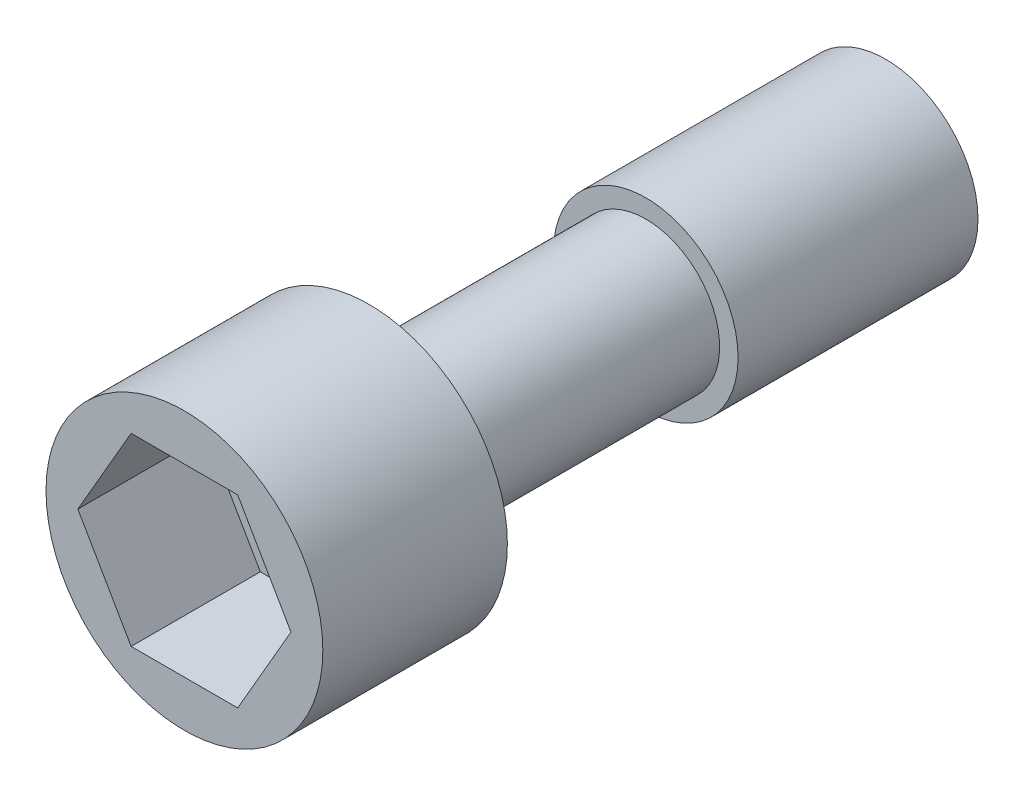
ISO-10303-21;
HEADER;
FILE_DESCRIPTION(('STEP AP214'),'2;1');
FILE_NAME('part.step','',(''),(''),'','','');
FILE_SCHEMA(('AUTOMOTIVE_DESIGN { 1 0 10303 214 1 1 1 1 }'));
ENDSEC;
DATA;
#1=APPLICATION_CONTEXT('core data for automotive mechanical design processes');
#2=APPLICATION_PROTOCOL_DEFINITION('international standard','automotive_design',2000,#1);
#3=PRODUCT_CONTEXT('',#1,'mechanical');
#4=PRODUCT('Part','Part','',(#3));
#5=PRODUCT_RELATED_PRODUCT_CATEGORY('part','',(#4));
#6=PRODUCT_DEFINITION_FORMATION('','',#4);
#7=PRODUCT_DEFINITION_CONTEXT('part definition',#1,'design');
#8=PRODUCT_DEFINITION('design','',#6,#7);
#9=PRODUCT_DEFINITION_SHAPE('','',#8);
#10=(LENGTH_UNIT() NAMED_UNIT(*) SI_UNIT(.MILLI.,.METRE.));
#11=(NAMED_UNIT(*) PLANE_ANGLE_UNIT() SI_UNIT($,.RADIAN.));
#12=(NAMED_UNIT(*) SI_UNIT($,.STERADIAN.) SOLID_ANGLE_UNIT());
#13=UNCERTAINTY_MEASURE_WITH_UNIT(LENGTH_MEASURE(1.E-05),#10,'distance_accuracy_value','');
#14=(GEOMETRIC_REPRESENTATION_CONTEXT(3) GLOBAL_UNCERTAINTY_ASSIGNED_CONTEXT((#13)) GLOBAL_UNIT_ASSIGNED_CONTEXT((#10,
#11,#12)) REPRESENTATION_CONTEXT('',''));
#15=CARTESIAN_POINT('',(0.,0.,0.));
#16=DIRECTION('',(0.,0.,1.));
#17=DIRECTION('',(1.,0.,0.));
#18=AXIS2_PLACEMENT_3D('',#15,#16,#17);
#19=CARTESIAN_POINT('',(0.,0.,10.));
#20=DIRECTION('',(0.,0.,1.));
#21=DIRECTION('',(1.,0.,0.));
#22=AXIS2_PLACEMENT_3D('',#19,#20,#21);
#23=PLANE('',#22);
#24=CARTESIAN_POINT('',(0.,0.,10.));
#25=DIRECTION('',(0.,0.,1.));
#26=DIRECTION('',(1.,0.,0.));
#27=AXIS2_PLACEMENT_3D('',#24,#25,#26);
#28=CIRCLE('',#27,7.5);
#29=CARTESIAN_POINT('',(7.5,0.,10.));
#30=VERTEX_POINT('',#29);
#31=EDGE_CURVE('E165',#30,#30,#28,.T.);
#32=ORIENTED_EDGE('',*,*,#31,.T.);
#33=EDGE_LOOP('',(#32));
#34=FACE_BOUND('',#33,.T.);
#35=DIRECTION('',(0.5,-0.866025403784439,0.));
#36=VECTOR('',#35,1.);
#37=CARTESIAN_POINT('',(4.33012701892219,2.5,10.));
#38=LINE('',#37,#36);
#39=CARTESIAN_POINT('',(2.88675134594813,5.,10.));
#40=VERTEX_POINT('',#39);
#41=CARTESIAN_POINT('',(5.77350269189626,0.,10.));
#42=VERTEX_POINT('',#41);
#43=EDGE_CURVE('E54',#40,#42,#38,.T.);
#44=ORIENTED_EDGE('',*,*,#43,.T.);
#45=DIRECTION('',(-0.5,-0.866025403784439,0.));
#46=VECTOR('',#45,1.);
#47=CARTESIAN_POINT('',(4.3301270189222,-2.5,10.));
#48=LINE('',#47,#46);
#49=CARTESIAN_POINT('',(2.88675134594813,-5.,10.));
#50=VERTEX_POINT('',#49);
#51=EDGE_CURVE('E11',#42,#50,#48,.T.);
#52=ORIENTED_EDGE('',*,*,#51,.T.);
#53=DIRECTION('',(-1.,0.,0.));
#54=VECTOR('',#53,1.);
#55=CARTESIAN_POINT('',(0.,-5.,10.));
#56=LINE('',#55,#54);
#57=CARTESIAN_POINT('',(-2.88675134594813,-5.,10.));
#58=VERTEX_POINT('',#57);
#59=EDGE_CURVE('E164',#50,#58,#56,.T.);
#60=ORIENTED_EDGE('',*,*,#59,.T.);
#61=DIRECTION('',(-0.5,0.866025403784439,0.));
#62=VECTOR('',#61,1.);
#63=CARTESIAN_POINT('',(-4.33012701892219,-2.5,10.));
#64=LINE('',#63,#62);
#65=CARTESIAN_POINT('',(-5.77350269189626,0.,10.));
#66=VERTEX_POINT('',#65);
#67=EDGE_CURVE('E175',#58,#66,#64,.T.);
#68=ORIENTED_EDGE('',*,*,#67,.T.);
#69=DIRECTION('',(0.5,0.866025403784439,0.));
#70=VECTOR('',#69,1.);
#71=CARTESIAN_POINT('',(-4.33012701892219,2.5,10.));
#72=LINE('',#71,#70);
#73=CARTESIAN_POINT('',(-2.88675134594813,5.,10.));
#74=VERTEX_POINT('',#73);
#75=EDGE_CURVE('E179',#66,#74,#72,.T.);
#76=ORIENTED_EDGE('',*,*,#75,.T.);
#77=DIRECTION('',(1.,0.,0.));
#78=VECTOR('',#77,1.);
#79=CARTESIAN_POINT('',(0.,5.,10.));
#80=LINE('',#79,#78);
#81=EDGE_CURVE('E183',#74,#40,#80,.T.);
#82=ORIENTED_EDGE('',*,*,#81,.T.);
#83=EDGE_LOOP('',(#44,#52,#60,#68,#76,#82));
#84=FACE_BOUND('',#83,.T.);
#85=ADVANCED_FACE('F45',(#34,#84),#23,.T.);
#86=CARTESIAN_POINT('',(0.,0.,10.));
#87=DIRECTION('',(0.,0.,-1.));
#88=DIRECTION('',(-1.,0.,0.));
#89=AXIS2_PLACEMENT_3D('',#86,#87,#88);
#90=CYLINDRICAL_SURFACE('',#89,7.5);
#91=ORIENTED_EDGE('',*,*,#31,.F.);
#92=EDGE_LOOP('',(#91));
#93=FACE_BOUND('',#92,.T.);
#94=CARTESIAN_POINT('',(0.,0.,0.));
#95=DIRECTION('',(0.,0.,1.));
#96=DIRECTION('',(1.,0.,0.));
#97=AXIS2_PLACEMENT_3D('',#94,#95,#96);
#98=CIRCLE('',#97,7.5);
#99=CARTESIAN_POINT('',(7.5,0.,0.));
#100=VERTEX_POINT('',#99);
#101=EDGE_CURVE('E159',#100,#100,#98,.T.);
#102=ORIENTED_EDGE('',*,*,#101,.T.);
#103=EDGE_LOOP('',(#102));
#104=FACE_BOUND('',#103,.T.);
#105=ADVANCED_FACE('F47',(#93,#104),#90,.T.);
#106=CARTESIAN_POINT('',(0.,0.,0.));
#107=DIRECTION('',(0.,0.,1.));
#108=DIRECTION('',(1.,0.,0.));
#109=AXIS2_PLACEMENT_3D('',#106,#107,#108);
#110=PLANE('',#109);
#111=CARTESIAN_POINT('',(0.,0.,0.));
#112=DIRECTION('',(0.,0.,-1.));
#113=DIRECTION('',(-1.,0.,0.));
#114=AXIS2_PLACEMENT_3D('',#111,#112,#113);
#115=CIRCLE('',#114,4.);
#116=CARTESIAN_POINT('',(-4.,0.,0.));
#117=VERTEX_POINT('',#116);
#118=EDGE_CURVE('E160',#117,#117,#115,.T.);
#119=ORIENTED_EDGE('',*,*,#118,.F.);
#120=EDGE_LOOP('',(#119));
#121=FACE_BOUND('',#120,.T.);
#122=ORIENTED_EDGE('',*,*,#101,.F.);
#123=EDGE_LOOP('',(#122));
#124=FACE_BOUND('',#123,.T.);
#125=ADVANCED_FACE('F215',(#121,#124),#110,.F.);
#126=CARTESIAN_POINT('',(0.,0.,-15.));
#127=DIRECTION('',(0.,0.,1.));
#128=DIRECTION('',(1.,0.,0.));
#129=AXIS2_PLACEMENT_3D('',#126,#127,#128);
#130=CYLINDRICAL_SURFACE('',#129,4.);
#131=CARTESIAN_POINT('',(0.,0.,-15.));
#132=DIRECTION('',(0.,0.,-1.));
#133=DIRECTION('',(-1.,0.,0.));
#134=AXIS2_PLACEMENT_3D('',#131,#132,#133);
#135=CIRCLE('',#134,4.);
#136=CARTESIAN_POINT('',(-4.,0.,-15.));
#137=VERTEX_POINT('',#136);
#138=EDGE_CURVE('E152',#137,#137,#135,.T.);
#139=ORIENTED_EDGE('',*,*,#138,.F.);
#140=EDGE_LOOP('',(#139));
#141=FACE_BOUND('',#140,.T.);
#142=ORIENTED_EDGE('',*,*,#118,.T.);
#143=EDGE_LOOP('',(#142));
#144=FACE_BOUND('',#143,.T.);
#145=ADVANCED_FACE('F218',(#141,#144),#130,.T.);
#146=CARTESIAN_POINT('',(0.,0.,-28.));
#147=DIRECTION('',(0.,0.,1.));
#148=DIRECTION('',(1.,0.,0.));
#149=AXIS2_PLACEMENT_3D('',#146,#147,#148);
#150=CYLINDRICAL_SURFACE('',#149,5.);
#151=CARTESIAN_POINT('',(0.,0.,-28.));
#152=DIRECTION('',(0.,0.,-1.));
#153=DIRECTION('',(-1.,0.,0.));
#154=AXIS2_PLACEMENT_3D('',#151,#152,#153);
#155=CIRCLE('',#154,5.);
#156=CARTESIAN_POINT('',(5.,0.,-28.));
#157=VERTEX_POINT('',#156);
#158=EDGE_CURVE('E148',#157,#157,#155,.T.);
#159=CARTESIAN_POINT('',(0.,0.,-15.));
#160=DIRECTION('',(0.,0.,-1.));
#161=DIRECTION('',(-1.,0.,0.));
#162=AXIS2_PLACEMENT_3D('',#159,#160,#161);
#163=CIRCLE('',#162,5.);
#164=CARTESIAN_POINT('',(5.,0.,-15.));
#165=VERTEX_POINT('',#164);
#166=EDGE_CURVE('E105',#165,#165,#163,.T.);
#167=CARTESIAN_POINT('',(5.,0.,-28.));
#168=CARTESIAN_POINT('',(5.,0.,-27.8645833333333));
#169=CARTESIAN_POINT('',(5.,0.,-27.7291666666667));
#170=CARTESIAN_POINT('',(5.,0.,-27.4583333333333));
#171=CARTESIAN_POINT('',(5.,0.,-27.3229166666667));
#172=CARTESIAN_POINT('',(5.,0.,-27.0520833333333));
#173=CARTESIAN_POINT('',(5.,0.,-26.9166666666667));
#174=CARTESIAN_POINT('',(5.,0.,-26.6458333333333));
#175=CARTESIAN_POINT('',(5.,0.,-26.5104166666667));
#176=CARTESIAN_POINT('',(5.,0.,-26.2395833333333));
#177=CARTESIAN_POINT('',(5.,0.,-26.1041666666667));
#178=CARTESIAN_POINT('',(5.,0.,-25.8333333333333));
#179=CARTESIAN_POINT('',(5.,0.,-25.6979166666667));
#180=CARTESIAN_POINT('',(5.,0.,-25.4270833333333));
#181=CARTESIAN_POINT('',(5.,0.,-25.2916666666667));
#182=CARTESIAN_POINT('',(5.,0.,-25.0208333333333));
#183=CARTESIAN_POINT('',(5.,0.,-24.8854166666667));
#184=CARTESIAN_POINT('',(5.,0.,-24.6145833333333));
#185=CARTESIAN_POINT('',(5.,0.,-24.4791666666667));
#186=CARTESIAN_POINT('',(5.,0.,-24.2083333333333));
#187=CARTESIAN_POINT('',(5.,0.,-24.0729166666667));
#188=CARTESIAN_POINT('',(5.,0.,-23.8020833333333));
#189=CARTESIAN_POINT('',(5.,0.,-23.6666666666667));
#190=CARTESIAN_POINT('',(5.,0.,-23.3958333333333));
#191=CARTESIAN_POINT('',(5.,0.,-23.2604166666667));
#192=CARTESIAN_POINT('',(5.,0.,-22.9895833333333));
#193=CARTESIAN_POINT('',(5.,0.,-22.8541666666667));
#194=CARTESIAN_POINT('',(5.,0.,-22.5833333333333));
#195=CARTESIAN_POINT('',(5.,0.,-22.4479166666667));
#196=CARTESIAN_POINT('',(5.,0.,-22.1770833333333));
#197=CARTESIAN_POINT('',(5.,0.,-22.0416666666667));
#198=CARTESIAN_POINT('',(5.,0.,-21.7708333333333));
#199=CARTESIAN_POINT('',(5.,0.,-21.6354166666667));
#200=CARTESIAN_POINT('',(5.,0.,-21.3645833333333));
#201=CARTESIAN_POINT('',(5.,0.,-21.2291666666667));
#202=CARTESIAN_POINT('',(5.,0.,-20.9583333333333));
#203=CARTESIAN_POINT('',(5.,0.,-20.8229166666667));
#204=CARTESIAN_POINT('',(5.,0.,-20.5520833333333));
#205=CARTESIAN_POINT('',(5.,0.,-20.4166666666667));
#206=CARTESIAN_POINT('',(5.,0.,-20.1458333333333));
#207=CARTESIAN_POINT('',(5.,0.,-20.0104166666667));
#208=CARTESIAN_POINT('',(5.,0.,-19.7395833333333));
#209=CARTESIAN_POINT('',(5.,0.,-19.6041666666667));
#210=CARTESIAN_POINT('',(5.,0.,-19.3333333333333));
#211=CARTESIAN_POINT('',(5.,0.,-19.1979166666667));
#212=CARTESIAN_POINT('',(5.,0.,-18.9270833333333));
#213=CARTESIAN_POINT('',(5.,0.,-18.7916666666667));
#214=CARTESIAN_POINT('',(5.,0.,-18.5208333333333));
#215=CARTESIAN_POINT('',(5.,0.,-18.3854166666667));
#216=CARTESIAN_POINT('',(5.,0.,-18.1145833333333));
#217=CARTESIAN_POINT('',(5.,0.,-17.9791666666667));
#218=CARTESIAN_POINT('',(5.,0.,-17.7083333333333));
#219=CARTESIAN_POINT('',(5.,0.,-17.5729166666667));
#220=CARTESIAN_POINT('',(5.,0.,-17.3020833333333));
#221=CARTESIAN_POINT('',(5.,0.,-17.1666666666667));
#222=CARTESIAN_POINT('',(5.,0.,-16.8958333333333));
#223=CARTESIAN_POINT('',(5.,0.,-16.7604166666667));
#224=CARTESIAN_POINT('',(5.,0.,-16.4895833333333));
#225=CARTESIAN_POINT('',(5.,0.,-16.3541666666667));
#226=CARTESIAN_POINT('',(5.,0.,-16.0833333333333));
#227=CARTESIAN_POINT('',(5.,0.,-15.9479166666667));
#228=CARTESIAN_POINT('',(5.,0.,-15.6770833333333));
#229=CARTESIAN_POINT('',(5.,0.,-15.5416666666667));
#230=CARTESIAN_POINT('',(5.,0.,-15.2708333333333));
#231=CARTESIAN_POINT('',(5.,0.,-15.1354166666667));
#232=CARTESIAN_POINT('',(5.,0.,-15.));
#233=B_SPLINE_CURVE_WITH_KNOTS('',3,(#167,#168,#169,#170,#171,#172,#173,#174,#175,#176,#177,
#178,#179,#180,#181,#182,#183,#184,#185,#186,#187,#188,#189,#190,#191,#192,#193,#194,#195,#196,
#197,#198,#199,#200,#201,#202,#203,#204,#205,#206,#207,#208,#209,#210,#211,#212,#213,#214,#215,
#216,#217,#218,#219,#220,#221,#222,#223,#224,#225,#226,#227,#228,#229,#230,#231,#232),
.UNSPECIFIED.,.F.,.F.,(4,2,2,2,2,2,2,2,2,2,2,2,2,2,2,2,2,2,2,2,2,2,2,2,2,2,2,2,2,2,2,2,4),(0.,
0.40625,0.812500000000001,1.21875,1.625,2.03125,2.4375,2.84375,3.25,3.65625,4.0625,4.46875,
4.875,5.28125,5.6875,6.09375,6.5,6.90625,7.3125,7.71875,8.125,8.53125,8.9375,9.34375,9.75,
10.15625,10.5625,10.96875,11.375,11.78125,12.1875,12.59375,13.),.UNSPECIFIED.);
#234=EDGE_CURVE('BSEAM225',#157,#165,#233,.T.);
#235=ORIENTED_EDGE('',*,*,#158,.F.);
#236=ORIENTED_EDGE('',*,*,#166,.T.);
#237=ORIENTED_EDGE('',*,*,#234,.T.);
#238=ORIENTED_EDGE('',*,*,#234,.F.);
#239=EDGE_LOOP('',(#235,#237,#236,#238));
#240=FACE_BOUND('',#239,.T.);
#241=ADVANCED_FACE('F225',(#240),#150,.T.);
#242=CARTESIAN_POINT('',(0.,0.,-28.));
#243=DIRECTION('',(0.,0.,-1.));
#244=DIRECTION('',(-1.,0.,0.));
#245=AXIS2_PLACEMENT_3D('',#242,#243,#244);
#246=PLANE('',#245);
#247=ORIENTED_EDGE('',*,*,#158,.T.);
#248=EDGE_LOOP('',(#247));
#249=FACE_BOUND('',#248,.T.);
#250=ADVANCED_FACE('F235',(#249),#246,.T.);
#251=CARTESIAN_POINT('',(0.,0.,-15.));
#252=DIRECTION('',(0.,0.,-1.));
#253=DIRECTION('',(-1.,0.,0.));
#254=AXIS2_PLACEMENT_3D('',#251,#252,#253);
#255=PLANE('',#254);
#256=ORIENTED_EDGE('',*,*,#138,.T.);
#257=EDGE_LOOP('',(#256));
#258=FACE_BOUND('',#257,.T.);
#259=ORIENTED_EDGE('',*,*,#166,.F.);
#260=EDGE_LOOP('',(#259));
#261=FACE_BOUND('',#260,.T.);
#262=ADVANCED_FACE('F239',(#258,#261),#255,.F.);
#263=CARTESIAN_POINT('',(2.88675134594813,-5.,10.000012));
#264=DIRECTION('',(-0.866025403784439,0.5,0.));
#265=DIRECTION('',(-0.5,-0.866025403784439,0.));
#266=AXIS2_PLACEMENT_3D('',#263,#264,#265);
#267=PLANE('',#266);
#268=DIRECTION('',(0.,0.,-1.));
#269=VECTOR('',#268,1.);
#270=CARTESIAN_POINT('',(5.77350269189626,0.,10.000012));
#271=LINE('',#270,#269);
#272=CARTESIAN_POINT('',(5.77350269189626,0.,3.));
#273=VERTEX_POINT('',#272);
#274=EDGE_CURVE('E96',#42,#273,#271,.T.);
#275=ORIENTED_EDGE('',*,*,#274,.T.);
#276=DIRECTION('',(0.5,0.866025403784439,0.));
#277=VECTOR('',#276,1.);
#278=CARTESIAN_POINT('',(2.88675134594813,-5.,3.));
#279=LINE('',#278,#277);
#280=CARTESIAN_POINT('',(2.88675134594813,-5.,3.));
#281=VERTEX_POINT('',#280);
#282=EDGE_CURVE('E100',#281,#273,#279,.T.);
#283=ORIENTED_EDGE('',*,*,#282,.F.);
#284=DIRECTION('',(0.,0.,-1.));
#285=VECTOR('',#284,1.);
#286=CARTESIAN_POINT('',(2.88675134594813,-5.,10.000012));
#287=LINE('',#286,#285);
#288=EDGE_CURVE('E135',#50,#281,#287,.T.);
#289=ORIENTED_EDGE('',*,*,#288,.F.);
#290=ORIENTED_EDGE('',*,*,#51,.F.);
#291=EDGE_LOOP('',(#275,#283,#289,#290));
#292=FACE_BOUND('',#291,.T.);
#293=ADVANCED_FACE('F98',(#292),#267,.T.);
#294=CARTESIAN_POINT('',(5.77350269189626,0.,10.000012));
#295=DIRECTION('',(-0.866025403784439,-0.5,0.));
#296=DIRECTION('',(0.5,-0.866025403784439,0.));
#297=AXIS2_PLACEMENT_3D('',#294,#295,#296);
#298=PLANE('',#297);
#299=DIRECTION('',(0.,0.,-1.));
#300=VECTOR('',#299,1.);
#301=CARTESIAN_POINT('',(2.88675134594813,5.,10.000012));
#302=LINE('',#301,#300);
#303=CARTESIAN_POINT('',(2.88675134594813,5.,3.));
#304=VERTEX_POINT('',#303);
#305=EDGE_CURVE('E106',#40,#304,#302,.T.);
#306=ORIENTED_EDGE('',*,*,#305,.T.);
#307=DIRECTION('',(-0.5,0.866025403784439,0.));
#308=VECTOR('',#307,1.);
#309=CARTESIAN_POINT('',(5.77350269189626,0.,3.));
#310=LINE('',#309,#308);
#311=EDGE_CURVE('E109',#273,#304,#310,.T.);
#312=ORIENTED_EDGE('',*,*,#311,.F.);
#313=ORIENTED_EDGE('',*,*,#274,.F.);
#314=ORIENTED_EDGE('',*,*,#43,.F.);
#315=EDGE_LOOP('',(#306,#312,#313,#314));
#316=FACE_BOUND('',#315,.T.);
#317=ADVANCED_FACE('F110',(#316),#298,.T.);
#318=CARTESIAN_POINT('',(2.88675134594813,5.,10.000012));
#319=DIRECTION('',(0.,-1.,0.));
#320=DIRECTION('',(1.,0.,0.));
#321=AXIS2_PLACEMENT_3D('',#318,#319,#320);
#322=PLANE('',#321);
#323=DIRECTION('',(0.,0.,-1.));
#324=VECTOR('',#323,1.);
#325=CARTESIAN_POINT('',(-2.88675134594813,5.,10.000012));
#326=LINE('',#325,#324);
#327=CARTESIAN_POINT('',(-2.88675134594813,5.,3.));
#328=VERTEX_POINT('',#327);
#329=EDGE_CURVE('E143',#74,#328,#326,.T.);
#330=ORIENTED_EDGE('',*,*,#329,.T.);
#331=DIRECTION('',(-1.,0.,0.));
#332=VECTOR('',#331,1.);
#333=CARTESIAN_POINT('',(2.88675134594813,5.,3.));
#334=LINE('',#333,#332);
#335=EDGE_CURVE('E116',#304,#328,#334,.T.);
#336=ORIENTED_EDGE('',*,*,#335,.F.);
#337=ORIENTED_EDGE('',*,*,#305,.F.);
#338=ORIENTED_EDGE('',*,*,#81,.F.);
#339=EDGE_LOOP('',(#330,#336,#337,#338));
#340=FACE_BOUND('',#339,.T.);
#341=ADVANCED_FACE('F189',(#340),#322,.T.);
#342=CARTESIAN_POINT('',(-2.88675134594813,5.,10.000012));
#343=DIRECTION('',(0.866025403784439,-0.5,0.));
#344=DIRECTION('',(0.5,0.866025403784439,0.));
#345=AXIS2_PLACEMENT_3D('',#342,#343,#344);
#346=PLANE('',#345);
#347=DIRECTION('',(0.,0.,-1.));
#348=VECTOR('',#347,1.);
#349=CARTESIAN_POINT('',(-5.77350269189626,0.,10.000012));
#350=LINE('',#349,#348);
#351=CARTESIAN_POINT('',(-5.77350269189626,0.,3.));
#352=VERTEX_POINT('',#351);
#353=EDGE_CURVE('E140',#66,#352,#350,.T.);
#354=ORIENTED_EDGE('',*,*,#353,.T.);
#355=DIRECTION('',(-0.5,-0.866025403784439,0.));
#356=VECTOR('',#355,1.);
#357=CARTESIAN_POINT('',(-2.88675134594813,5.,3.));
#358=LINE('',#357,#356);
#359=EDGE_CURVE('E126',#328,#352,#358,.T.);
#360=ORIENTED_EDGE('',*,*,#359,.F.);
#361=ORIENTED_EDGE('',*,*,#329,.F.);
#362=ORIENTED_EDGE('',*,*,#75,.F.);
#363=EDGE_LOOP('',(#354,#360,#361,#362));
#364=FACE_BOUND('',#363,.T.);
#365=ADVANCED_FACE('F194',(#364),#346,.T.);
#366=CARTESIAN_POINT('',(-5.77350269189626,0.,10.000012));
#367=DIRECTION('',(0.866025403784439,0.5,0.));
#368=DIRECTION('',(-0.5,0.866025403784439,0.));
#369=AXIS2_PLACEMENT_3D('',#366,#367,#368);
#370=PLANE('',#369);
#371=DIRECTION('',(0.,0.,-1.));
#372=VECTOR('',#371,1.);
#373=CARTESIAN_POINT('',(-2.88675134594813,-5.,10.000012));
#374=LINE('',#373,#372);
#375=CARTESIAN_POINT('',(-2.88675134594813,-5.,3.));
#376=VERTEX_POINT('',#375);
#377=EDGE_CURVE('E61',#58,#376,#374,.T.);
#378=ORIENTED_EDGE('',*,*,#377,.T.);
#379=DIRECTION('',(0.5,-0.866025403784439,0.));
#380=VECTOR('',#379,1.);
#381=CARTESIAN_POINT('',(-5.77350269189626,0.,3.));
#382=LINE('',#381,#380);
#383=EDGE_CURVE('E130',#352,#376,#382,.T.);
#384=ORIENTED_EDGE('',*,*,#383,.F.);
#385=ORIENTED_EDGE('',*,*,#353,.F.);
#386=ORIENTED_EDGE('',*,*,#67,.F.);
#387=EDGE_LOOP('',(#378,#384,#385,#386));
#388=FACE_BOUND('',#387,.T.);
#389=ADVANCED_FACE('F197',(#388),#370,.T.);
#390=CARTESIAN_POINT('',(-2.88675134594813,-5.,10.000012));
#391=DIRECTION('',(0.,1.,0.));
#392=DIRECTION('',(0.,0.,1.));
#393=AXIS2_PLACEMENT_3D('',#390,#391,#392);
#394=PLANE('',#393);
#395=ORIENTED_EDGE('',*,*,#288,.T.);
#396=DIRECTION('',(1.,0.,0.));
#397=VECTOR('',#396,1.);
#398=CARTESIAN_POINT('',(-2.88675134594813,-5.,3.));
#399=LINE('',#398,#397);
#400=EDGE_CURVE('E120',#376,#281,#399,.T.);
#401=ORIENTED_EDGE('',*,*,#400,.F.);
#402=ORIENTED_EDGE('',*,*,#377,.F.);
#403=ORIENTED_EDGE('',*,*,#59,.F.);
#404=EDGE_LOOP('',(#395,#401,#402,#403));
#405=FACE_BOUND('',#404,.T.);
#406=ADVANCED_FACE('F198',(#405),#394,.T.);
#407=CARTESIAN_POINT('',(0.,0.,3.));
#408=DIRECTION('',(0.,0.,1.));
#409=DIRECTION('',(1.,0.,0.));
#410=AXIS2_PLACEMENT_3D('',#407,#408,#409);
#411=PLANE('',#410);
#412=ORIENTED_EDGE('',*,*,#282,.T.);
#413=ORIENTED_EDGE('',*,*,#311,.T.);
#414=ORIENTED_EDGE('',*,*,#335,.T.);
#415=ORIENTED_EDGE('',*,*,#359,.T.);
#416=ORIENTED_EDGE('',*,*,#383,.T.);
#417=ORIENTED_EDGE('',*,*,#400,.T.);
#418=EDGE_LOOP('',(#412,#413,#414,#415,#416,#417));
#419=FACE_BOUND('',#418,.T.);
#420=ADVANCED_FACE('F118',(#419),#411,.T.);
#421=CLOSED_SHELL('',(#85,#105,#125,#145,#241,#250,#262,#293,#317,#341,#365,#389,#406,#420));
#422=MANIFOLD_SOLID_BREP('B2',#421);
#423=ADVANCED_BREP_SHAPE_REPRESENTATION('',(#18,#422),#14);
#424=SHAPE_DEFINITION_REPRESENTATION(#9,#423);
ENDSEC;
END-ISO-10303-21;
